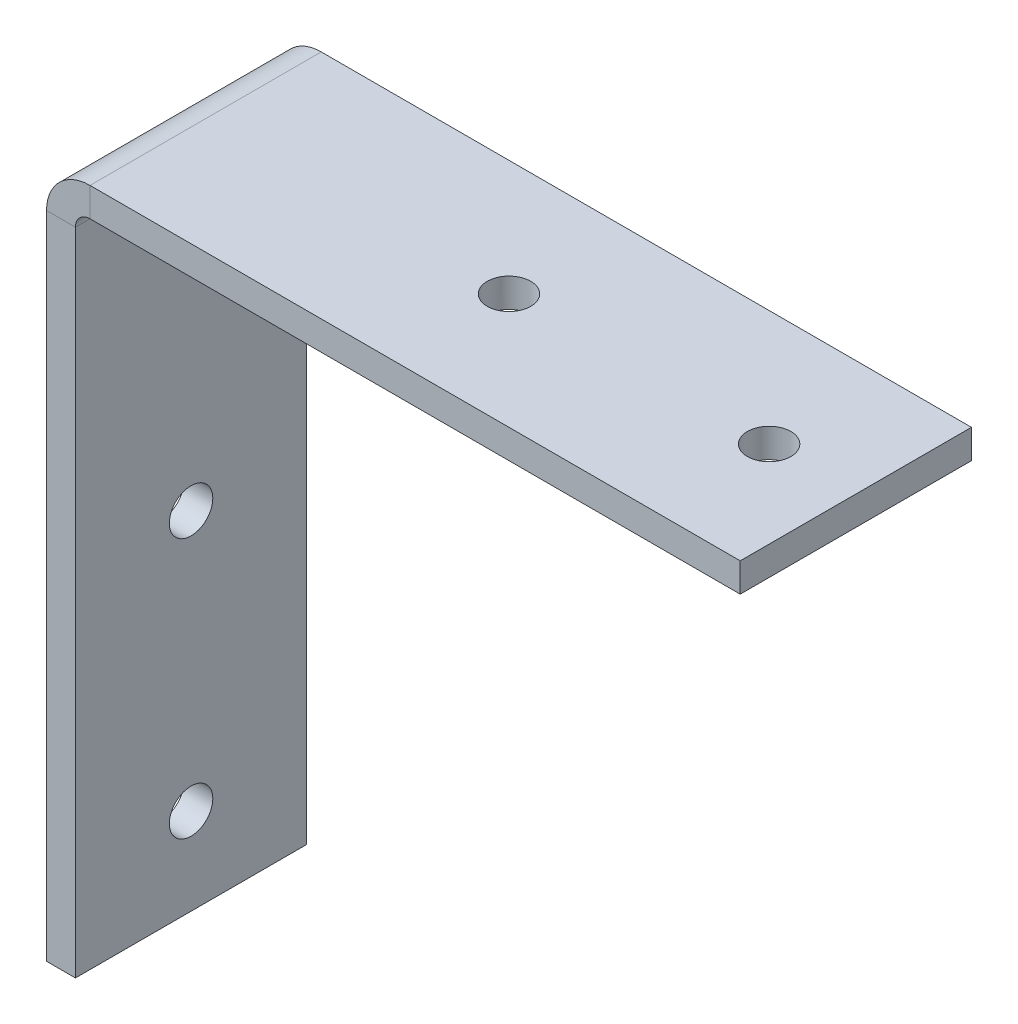
ISO-10303-21;
HEADER;
FILE_DESCRIPTION(('STEP AP214'),'2;1');
FILE_NAME('part.step','',(''),(''),'','','');
FILE_SCHEMA(('AUTOMOTIVE_DESIGN { 1 0 10303 214 1 1 1 1 }'));
ENDSEC;
DATA;
#1=APPLICATION_CONTEXT('core data for automotive mechanical design processes');
#2=APPLICATION_PROTOCOL_DEFINITION('international standard','automotive_design',2000,#1);
#3=PRODUCT_CONTEXT('',#1,'mechanical');
#4=PRODUCT('Part','Part','',(#3));
#5=PRODUCT_RELATED_PRODUCT_CATEGORY('part','',(#4));
#6=PRODUCT_DEFINITION_FORMATION('','',#4);
#7=PRODUCT_DEFINITION_CONTEXT('part definition',#1,'design');
#8=PRODUCT_DEFINITION('design','',#6,#7);
#9=PRODUCT_DEFINITION_SHAPE('','',#8);
#10=(LENGTH_UNIT() NAMED_UNIT(*) SI_UNIT(.MILLI.,.METRE.));
#11=(NAMED_UNIT(*) PLANE_ANGLE_UNIT() SI_UNIT($,.RADIAN.));
#12=(NAMED_UNIT(*) SI_UNIT($,.STERADIAN.) SOLID_ANGLE_UNIT());
#13=UNCERTAINTY_MEASURE_WITH_UNIT(LENGTH_MEASURE(1.E-05),#10,'distance_accuracy_value','');
#14=(GEOMETRIC_REPRESENTATION_CONTEXT(3) GLOBAL_UNCERTAINTY_ASSIGNED_CONTEXT((#13)) GLOBAL_UNIT_ASSIGNED_CONTEXT((#10,
#11,#12)) REPRESENTATION_CONTEXT('',''));
#15=CARTESIAN_POINT('',(0.,0.,0.));
#16=DIRECTION('',(0.,0.,1.));
#17=DIRECTION('',(1.,0.,0.));
#18=AXIS2_PLACEMENT_3D('',#15,#16,#17);
#19=CARTESIAN_POINT('',(0.,-4.7752,-25.4));
#20=DIRECTION('',(0.,0.,-1.));
#21=DIRECTION('',(-1.,0.,0.));
#22=AXIS2_PLACEMENT_3D('',#19,#20,#21);
#23=PLANE('',#22);
#24=DIRECTION('',(1.,0.,0.));
#25=VECTOR('',#24,1.);
#26=CARTESIAN_POINT('',(0.,-4.7752,-25.4));
#27=LINE('',#26,#25);
#28=CARTESIAN_POINT('',(0.,-4.7752,-25.4));
#29=VERTEX_POINT('',#28);
#30=CARTESIAN_POINT('',(3.175,-4.7752,-25.4));
#31=VERTEX_POINT('',#30);
#32=EDGE_CURVE('E11',#29,#31,#27,.T.);
#33=ORIENTED_EDGE('',*,*,#32,.F.);
#34=CARTESIAN_POINT('',(4.7752,-4.7752,-25.4));
#35=DIRECTION('',(0.,0.,1.));
#36=DIRECTION('',(1.,0.,0.));
#37=AXIS2_PLACEMENT_3D('',#34,#35,#36);
#38=CIRCLE('',#37,4.7752);
#39=CARTESIAN_POINT('',(4.7752,0.,-25.4));
#40=VERTEX_POINT('',#39);
#41=EDGE_CURVE('E149',#29,#40,#38,.F.);
#42=ORIENTED_EDGE('',*,*,#41,.T.);
#43=DIRECTION('',(0.,1.,0.));
#44=VECTOR('',#43,1.);
#45=CARTESIAN_POINT('',(4.7752,-3.175,-25.4));
#46=LINE('',#45,#44);
#47=CARTESIAN_POINT('',(4.7752,-3.175,-25.4));
#48=VERTEX_POINT('',#47);
#49=EDGE_CURVE('E41',#48,#40,#46,.T.);
#50=ORIENTED_EDGE('',*,*,#49,.F.);
#51=CARTESIAN_POINT('',(4.7752,-4.7752,-25.4));
#52=DIRECTION('',(0.,0.,1.));
#53=DIRECTION('',(1.,0.,0.));
#54=AXIS2_PLACEMENT_3D('',#51,#52,#53);
#55=CIRCLE('',#54,1.6002);
#56=EDGE_CURVE('E109',#31,#48,#55,.F.);
#57=ORIENTED_EDGE('',*,*,#56,.F.);
#58=EDGE_LOOP('',(#33,#42,#50,#57));
#59=FACE_BOUND('',#58,.T.);
#60=ADVANCED_FACE('F34',(#59),#23,.T.);
#61=CARTESIAN_POINT('',(4.7752,-3.175,-25.4));
#62=DIRECTION('',(0.,0.,-1.));
#63=DIRECTION('',(-1.,0.,0.));
#64=AXIS2_PLACEMENT_3D('',#61,#62,#63);
#65=PLANE('',#64);
#66=DIRECTION('',(0.,1.,0.));
#67=VECTOR('',#66,1.);
#68=CARTESIAN_POINT('',(0.,0.,-25.4));
#69=LINE('',#68,#67);
#70=CARTESIAN_POINT('',(0.,-76.2,-25.4));
#71=VERTEX_POINT('',#70);
#72=EDGE_CURVE('E151',#71,#29,#69,.T.);
#73=ORIENTED_EDGE('',*,*,#72,.T.);
#74=ORIENTED_EDGE('',*,*,#32,.T.);
#75=DIRECTION('',(0.,1.,0.));
#76=VECTOR('',#75,1.);
#77=CARTESIAN_POINT('',(3.175,0.,-25.4));
#78=LINE('',#77,#76);
#79=CARTESIAN_POINT('',(3.17500000000001,-76.2,-25.4));
#80=VERTEX_POINT('',#79);
#81=EDGE_CURVE('E155',#80,#31,#78,.T.);
#82=ORIENTED_EDGE('',*,*,#81,.F.);
#83=DIRECTION('',(-1.,0.,0.));
#84=VECTOR('',#83,1.);
#85=CARTESIAN_POINT('',(3.17500000000001,-76.2,-25.4));
#86=LINE('',#85,#84);
#87=EDGE_CURVE('E153',#80,#71,#86,.T.);
#88=ORIENTED_EDGE('',*,*,#87,.T.);
#89=EDGE_LOOP('',(#73,#74,#82,#88));
#90=FACE_BOUND('',#89,.T.);
#91=ADVANCED_FACE('F202',(#90),#65,.T.);
#92=CARTESIAN_POINT('',(4.7752,0.,0.));
#93=DIRECTION('',(0.,0.,1.));
#94=DIRECTION('',(1.,0.,0.));
#95=AXIS2_PLACEMENT_3D('',#92,#93,#94);
#96=PLANE('',#95);
#97=DIRECTION('',(0.,-1.,0.));
#98=VECTOR('',#97,1.);
#99=CARTESIAN_POINT('',(4.7752,0.,0.));
#100=LINE('',#99,#98);
#101=CARTESIAN_POINT('',(4.7752,0.,0.));
#102=VERTEX_POINT('',#101);
#103=CARTESIAN_POINT('',(4.7752,-3.175,0.));
#104=VERTEX_POINT('',#103);
#105=EDGE_CURVE('E121',#102,#104,#100,.T.);
#106=ORIENTED_EDGE('',*,*,#105,.F.);
#107=CARTESIAN_POINT('',(4.7752,-4.7752,0.));
#108=DIRECTION('',(0.,0.,1.));
#109=DIRECTION('',(1.,0.,0.));
#110=AXIS2_PLACEMENT_3D('',#107,#108,#109);
#111=CIRCLE('',#110,4.7752);
#112=CARTESIAN_POINT('',(0.,-4.7752,0.));
#113=VERTEX_POINT('',#112);
#114=EDGE_CURVE('E131',#113,#102,#111,.F.);
#115=ORIENTED_EDGE('',*,*,#114,.F.);
#116=DIRECTION('',(-1.,0.,0.));
#117=VECTOR('',#116,1.);
#118=CARTESIAN_POINT('',(3.175,-4.7752,0.));
#119=LINE('',#118,#117);
#120=CARTESIAN_POINT('',(3.175,-4.7752,0.));
#121=VERTEX_POINT('',#120);
#122=EDGE_CURVE('E162',#121,#113,#119,.T.);
#123=ORIENTED_EDGE('',*,*,#122,.F.);
#124=CARTESIAN_POINT('',(4.7752,-4.7752,0.));
#125=DIRECTION('',(0.,0.,1.));
#126=DIRECTION('',(1.,0.,0.));
#127=AXIS2_PLACEMENT_3D('',#124,#125,#126);
#128=CIRCLE('',#127,1.6002);
#129=EDGE_CURVE('E142',#121,#104,#128,.F.);
#130=ORIENTED_EDGE('',*,*,#129,.T.);
#131=EDGE_LOOP('',(#106,#115,#123,#130));
#132=FACE_BOUND('',#131,.T.);
#133=ADVANCED_FACE('F206',(#132),#96,.T.);
#134=CARTESIAN_POINT('',(3.175,-4.7752,0.));
#135=DIRECTION('',(0.,0.,1.));
#136=DIRECTION('',(1.,0.,0.));
#137=AXIS2_PLACEMENT_3D('',#134,#135,#136);
#138=PLANE('',#137);
#139=DIRECTION('',(1.,0.,0.));
#140=VECTOR('',#139,1.);
#141=CARTESIAN_POINT('',(0.,0.,0.));
#142=LINE('',#141,#140);
#143=CARTESIAN_POINT('',(76.2,0.,0.));
#144=VERTEX_POINT('',#143);
#145=EDGE_CURVE('E118',#102,#144,#142,.T.);
#146=ORIENTED_EDGE('',*,*,#145,.F.);
#147=ORIENTED_EDGE('',*,*,#105,.T.);
#148=DIRECTION('',(1.,0.,0.));
#149=VECTOR('',#148,1.);
#150=CARTESIAN_POINT('',(0.,-3.175,0.));
#151=LINE('',#150,#149);
#152=CARTESIAN_POINT('',(76.2,-3.175,0.));
#153=VERTEX_POINT('',#152);
#154=EDGE_CURVE('E102',#104,#153,#151,.T.);
#155=ORIENTED_EDGE('',*,*,#154,.T.);
#156=DIRECTION('',(0.,-1.,0.));
#157=VECTOR('',#156,1.);
#158=CARTESIAN_POINT('',(76.2,0.,0.));
#159=LINE('',#158,#157);
#160=EDGE_CURVE('E113',#144,#153,#159,.T.);
#161=ORIENTED_EDGE('',*,*,#160,.F.);
#162=EDGE_LOOP('',(#146,#147,#155,#161));
#163=FACE_BOUND('',#162,.T.);
#164=ADVANCED_FACE('F120',(#163),#138,.T.);
#165=CARTESIAN_POINT('',(0.,-3.175,-25.4));
#166=DIRECTION('',(0.,-1.,0.));
#167=DIRECTION('',(0.,0.,-1.));
#168=AXIS2_PLACEMENT_3D('',#165,#166,#167);
#169=PLANE('',#168);
#170=CARTESIAN_POINT('',(38.1,-3.175,-12.7));
#171=DIRECTION('',(0.,-1.,0.));
#172=DIRECTION('',(0.,0.,-1.));
#173=AXIS2_PLACEMENT_3D('',#170,#171,#172);
#174=CIRCLE('',#173,2.38760000000001);
#175=CARTESIAN_POINT('',(38.1,-3.175,-15.0876));
#176=VERTEX_POINT('',#175);
#177=EDGE_CURVE('E227',#176,#176,#174,.T.);
#178=ORIENTED_EDGE('',*,*,#177,.F.);
#179=EDGE_LOOP('',(#178));
#180=FACE_BOUND('',#179,.T.);
#181=CARTESIAN_POINT('',(66.675,-3.175,-12.7));
#182=DIRECTION('',(0.,-1.,0.));
#183=DIRECTION('',(0.,0.,-1.));
#184=AXIS2_PLACEMENT_3D('',#181,#182,#183);
#185=CIRCLE('',#184,2.38760000000001);
#186=CARTESIAN_POINT('',(66.675,-3.175,-15.0876));
#187=VERTEX_POINT('',#186);
#188=EDGE_CURVE('E123',#187,#187,#185,.T.);
#189=ORIENTED_EDGE('',*,*,#188,.F.);
#190=EDGE_LOOP('',(#189));
#191=FACE_BOUND('',#190,.T.);
#192=ORIENTED_EDGE('',*,*,#154,.F.);
#193=DIRECTION('',(0.,0.,1.));
#194=VECTOR('',#193,1.);
#195=CARTESIAN_POINT('',(4.7752,-3.175,-25.4));
#196=LINE('',#195,#194);
#197=EDGE_CURVE('E160',#48,#104,#196,.T.);
#198=ORIENTED_EDGE('',*,*,#197,.F.);
#199=DIRECTION('',(1.,0.,0.));
#200=VECTOR('',#199,1.);
#201=CARTESIAN_POINT('',(0.,-3.175,-25.4));
#202=LINE('',#201,#200);
#203=CARTESIAN_POINT('',(76.2,-3.175,-25.4));
#204=VERTEX_POINT('',#203);
#205=EDGE_CURVE('E105',#48,#204,#202,.T.);
#206=ORIENTED_EDGE('',*,*,#205,.T.);
#207=DIRECTION('',(0.,0.,1.));
#208=VECTOR('',#207,1.);
#209=CARTESIAN_POINT('',(76.2,-3.175,-25.4));
#210=LINE('',#209,#208);
#211=EDGE_CURVE('E98',#204,#153,#210,.T.);
#212=ORIENTED_EDGE('',*,*,#211,.T.);
#213=EDGE_LOOP('',(#192,#198,#206,#212));
#214=FACE_BOUND('',#213,.T.);
#215=ADVANCED_FACE('F100',(#180,#191,#214),#169,.T.);
#216=CARTESIAN_POINT('',(4.7752,-4.7752,-25.4));
#217=DIRECTION('',(0.,0.,1.));
#218=DIRECTION('',(1.,0.,0.));
#219=AXIS2_PLACEMENT_3D('',#216,#217,#218);
#220=CYLINDRICAL_SURFACE('',#219,1.6002);
#221=ORIENTED_EDGE('',*,*,#129,.F.);
#222=DIRECTION('',(0.,0.,1.));
#223=VECTOR('',#222,1.);
#224=CARTESIAN_POINT('',(3.175,-4.7752,-25.4));
#225=LINE('',#224,#223);
#226=EDGE_CURVE('E163',#31,#121,#225,.T.);
#227=ORIENTED_EDGE('',*,*,#226,.F.);
#228=ORIENTED_EDGE('',*,*,#56,.T.);
#229=ORIENTED_EDGE('',*,*,#197,.T.);
#230=EDGE_LOOP('',(#221,#227,#228,#229));
#231=FACE_BOUND('',#230,.T.);
#232=ADVANCED_FACE('F216',(#231),#220,.F.);
#233=CARTESIAN_POINT('',(3.175,0.,-25.4));
#234=DIRECTION('',(1.,0.,0.));
#235=DIRECTION('',(0.,1.,0.));
#236=AXIS2_PLACEMENT_3D('',#233,#234,#235);
#237=PLANE('',#236);
#238=CARTESIAN_POINT('',(3.175,-38.1,-12.7));
#239=DIRECTION('',(1.,0.,0.));
#240=DIRECTION('',(0.,1.,0.));
#241=AXIS2_PLACEMENT_3D('',#238,#239,#240);
#242=CIRCLE('',#241,2.3876);
#243=CARTESIAN_POINT('',(3.175,-35.7124,-12.7));
#244=VERTEX_POINT('',#243);
#245=EDGE_CURVE('E249',#244,#244,#242,.T.);
#246=ORIENTED_EDGE('',*,*,#245,.F.);
#247=EDGE_LOOP('',(#246));
#248=FACE_BOUND('',#247,.T.);
#249=CARTESIAN_POINT('',(3.17500000000001,-66.675,-12.7));
#250=DIRECTION('',(1.,0.,0.));
#251=DIRECTION('',(0.,1.,0.));
#252=AXIS2_PLACEMENT_3D('',#249,#250,#251);
#253=CIRCLE('',#252,2.3876);
#254=CARTESIAN_POINT('',(3.17500000000001,-64.2874,-12.7));
#255=VERTEX_POINT('',#254);
#256=EDGE_CURVE('E243',#255,#255,#253,.T.);
#257=ORIENTED_EDGE('',*,*,#256,.F.);
#258=EDGE_LOOP('',(#257));
#259=FACE_BOUND('',#258,.T.);
#260=DIRECTION('',(0.,1.,0.));
#261=VECTOR('',#260,1.);
#262=CARTESIAN_POINT('',(3.175,0.,0.));
#263=LINE('',#262,#261);
#264=CARTESIAN_POINT('',(3.17500000000001,-76.2,0.));
#265=VERTEX_POINT('',#264);
#266=EDGE_CURVE('E139',#265,#121,#263,.T.);
#267=ORIENTED_EDGE('',*,*,#266,.F.);
#268=DIRECTION('',(0.,0.,1.));
#269=VECTOR('',#268,1.);
#270=CARTESIAN_POINT('',(3.17500000000001,-76.2,-25.4));
#271=LINE('',#270,#269);
#272=EDGE_CURVE('E166',#80,#265,#271,.T.);
#273=ORIENTED_EDGE('',*,*,#272,.F.);
#274=ORIENTED_EDGE('',*,*,#81,.T.);
#275=ORIENTED_EDGE('',*,*,#226,.T.);
#276=EDGE_LOOP('',(#267,#273,#274,#275));
#277=FACE_BOUND('',#276,.T.);
#278=ADVANCED_FACE('F221',(#248,#259,#277),#237,.T.);
#279=CARTESIAN_POINT('',(3.17500000000001,-76.2,-25.4));
#280=DIRECTION('',(0.,1.,0.));
#281=DIRECTION('',(0.,0.,1.));
#282=AXIS2_PLACEMENT_3D('',#279,#280,#281);
#283=PLANE('',#282);
#284=DIRECTION('',(-1.,0.,0.));
#285=VECTOR('',#284,1.);
#286=CARTESIAN_POINT('',(3.17500000000001,-76.2,0.));
#287=LINE('',#286,#285);
#288=CARTESIAN_POINT('',(0.,-76.2,0.));
#289=VERTEX_POINT('',#288);
#290=EDGE_CURVE('E137',#265,#289,#287,.T.);
#291=ORIENTED_EDGE('',*,*,#290,.T.);
#292=DIRECTION('',(0.,0.,1.));
#293=VECTOR('',#292,1.);
#294=CARTESIAN_POINT('',(0.,-76.2,-25.4));
#295=LINE('',#294,#293);
#296=EDGE_CURVE('E168',#71,#289,#295,.T.);
#297=ORIENTED_EDGE('',*,*,#296,.F.);
#298=ORIENTED_EDGE('',*,*,#87,.F.);
#299=ORIENTED_EDGE('',*,*,#272,.T.);
#300=EDGE_LOOP('',(#291,#297,#298,#299));
#301=FACE_BOUND('',#300,.T.);
#302=ADVANCED_FACE('F260',(#301),#283,.F.);
#303=CARTESIAN_POINT('',(0.,0.,-25.4));
#304=DIRECTION('',(1.,0.,0.));
#305=DIRECTION('',(0.,1.,0.));
#306=AXIS2_PLACEMENT_3D('',#303,#304,#305);
#307=PLANE('',#306);
#308=CARTESIAN_POINT('',(0.,-38.1,-12.7));
#309=DIRECTION('',(-1.,0.,0.));
#310=DIRECTION('',(0.,-1.,0.));
#311=AXIS2_PLACEMENT_3D('',#308,#309,#310);
#312=CIRCLE('',#311,2.3876);
#313=CARTESIAN_POINT('',(0.,-40.4876,-12.7));
#314=VERTEX_POINT('',#313);
#315=EDGE_CURVE('E252',#314,#314,#312,.T.);
#316=ORIENTED_EDGE('',*,*,#315,.F.);
#317=EDGE_LOOP('',(#316));
#318=FACE_BOUND('',#317,.T.);
#319=CARTESIAN_POINT('',(0.,-66.675,-12.7));
#320=DIRECTION('',(-1.,0.,0.));
#321=DIRECTION('',(0.,-1.,0.));
#322=AXIS2_PLACEMENT_3D('',#319,#320,#321);
#323=CIRCLE('',#322,2.3876);
#324=CARTESIAN_POINT('',(0.,-69.0626,-12.7));
#325=VERTEX_POINT('',#324);
#326=EDGE_CURVE('E246',#325,#325,#323,.T.);
#327=ORIENTED_EDGE('',*,*,#326,.F.);
#328=EDGE_LOOP('',(#327));
#329=FACE_BOUND('',#328,.T.);
#330=DIRECTION('',(0.,1.,0.));
#331=VECTOR('',#330,1.);
#332=CARTESIAN_POINT('',(0.,0.,0.));
#333=LINE('',#332,#331);
#334=EDGE_CURVE('E134',#289,#113,#333,.T.);
#335=ORIENTED_EDGE('',*,*,#334,.T.);
#336=DIRECTION('',(0.,0.,1.));
#337=VECTOR('',#336,1.);
#338=CARTESIAN_POINT('',(0.,-4.7752,-25.4));
#339=LINE('',#338,#337);
#340=EDGE_CURVE('E171',#29,#113,#339,.T.);
#341=ORIENTED_EDGE('',*,*,#340,.F.);
#342=ORIENTED_EDGE('',*,*,#72,.F.);
#343=ORIENTED_EDGE('',*,*,#296,.T.);
#344=EDGE_LOOP('',(#335,#341,#342,#343));
#345=FACE_BOUND('',#344,.T.);
#346=ADVANCED_FACE('F197',(#318,#329,#345),#307,.F.);
#347=CARTESIAN_POINT('',(4.7752,-4.7752,-25.4));
#348=DIRECTION('',(0.,0.,1.));
#349=DIRECTION('',(1.,0.,0.));
#350=AXIS2_PLACEMENT_3D('',#347,#348,#349);
#351=CYLINDRICAL_SURFACE('',#350,4.7752);
#352=ORIENTED_EDGE('',*,*,#114,.T.);
#353=DIRECTION('',(0.,0.,1.));
#354=VECTOR('',#353,1.);
#355=CARTESIAN_POINT('',(4.7752,0.,-25.4));
#356=LINE('',#355,#354);
#357=EDGE_CURVE('E174',#40,#102,#356,.T.);
#358=ORIENTED_EDGE('',*,*,#357,.F.);
#359=ORIENTED_EDGE('',*,*,#41,.F.);
#360=ORIENTED_EDGE('',*,*,#340,.T.);
#361=EDGE_LOOP('',(#352,#358,#359,#360));
#362=FACE_BOUND('',#361,.T.);
#363=ADVANCED_FACE('F185',(#362),#351,.T.);
#364=CARTESIAN_POINT('',(0.,0.,-25.4));
#365=DIRECTION('',(0.,-1.,0.));
#366=DIRECTION('',(0.,0.,-1.));
#367=AXIS2_PLACEMENT_3D('',#364,#365,#366);
#368=PLANE('',#367);
#369=CARTESIAN_POINT('',(38.1,0.,-12.7));
#370=DIRECTION('',(0.,1.,0.));
#371=DIRECTION('',(0.,0.,1.));
#372=AXIS2_PLACEMENT_3D('',#369,#370,#371);
#373=CIRCLE('',#372,2.38760000000001);
#374=CARTESIAN_POINT('',(38.1,0.,-10.3124));
#375=VERTEX_POINT('',#374);
#376=EDGE_CURVE('E238',#375,#375,#373,.T.);
#377=ORIENTED_EDGE('',*,*,#376,.F.);
#378=EDGE_LOOP('',(#377));
#379=FACE_BOUND('',#378,.T.);
#380=CARTESIAN_POINT('',(66.675,0.,-12.7));
#381=DIRECTION('',(0.,1.,0.));
#382=DIRECTION('',(0.,0.,1.));
#383=AXIS2_PLACEMENT_3D('',#380,#381,#382);
#384=CIRCLE('',#383,2.38760000000001);
#385=CARTESIAN_POINT('',(66.675,0.,-10.3124));
#386=VERTEX_POINT('',#385);
#387=EDGE_CURVE('E126',#386,#386,#384,.T.);
#388=ORIENTED_EDGE('',*,*,#387,.F.);
#389=EDGE_LOOP('',(#388));
#390=FACE_BOUND('',#389,.T.);
#391=ORIENTED_EDGE('',*,*,#145,.T.);
#392=DIRECTION('',(0.,0.,1.));
#393=VECTOR('',#392,1.);
#394=CARTESIAN_POINT('',(76.2,0.,-25.4));
#395=LINE('',#394,#393);
#396=CARTESIAN_POINT('',(76.2,0.,-25.4));
#397=VERTEX_POINT('',#396);
#398=EDGE_CURVE('E108',#397,#144,#395,.T.);
#399=ORIENTED_EDGE('',*,*,#398,.F.);
#400=DIRECTION('',(1.,0.,0.));
#401=VECTOR('',#400,1.);
#402=CARTESIAN_POINT('',(0.,0.,-25.4));
#403=LINE('',#402,#401);
#404=EDGE_CURVE('E147',#40,#397,#403,.T.);
#405=ORIENTED_EDGE('',*,*,#404,.F.);
#406=ORIENTED_EDGE('',*,*,#357,.T.);
#407=EDGE_LOOP('',(#391,#399,#405,#406));
#408=FACE_BOUND('',#407,.T.);
#409=ADVANCED_FACE('F188',(#379,#390,#408),#368,.F.);
#410=CARTESIAN_POINT('',(76.2,0.,-25.4));
#411=DIRECTION('',(-1.,0.,0.));
#412=DIRECTION('',(0.,0.,1.));
#413=AXIS2_PLACEMENT_3D('',#410,#411,#412);
#414=PLANE('',#413);
#415=ORIENTED_EDGE('',*,*,#160,.T.);
#416=ORIENTED_EDGE('',*,*,#211,.F.);
#417=DIRECTION('',(0.,-1.,0.));
#418=VECTOR('',#417,1.);
#419=CARTESIAN_POINT('',(76.2,0.,-25.4));
#420=LINE('',#419,#418);
#421=EDGE_CURVE('E145',#397,#204,#420,.T.);
#422=ORIENTED_EDGE('',*,*,#421,.F.);
#423=ORIENTED_EDGE('',*,*,#398,.T.);
#424=EDGE_LOOP('',(#415,#416,#422,#423));
#425=FACE_BOUND('',#424,.T.);
#426=ADVANCED_FACE('F114',(#425),#414,.F.);
#427=CARTESIAN_POINT('',(4.7752,-4.7752,-25.4));
#428=DIRECTION('',(0.,0.,1.));
#429=DIRECTION('',(1.,0.,0.));
#430=AXIS2_PLACEMENT_3D('',#427,#428,#429);
#431=PLANE('',#430);
#432=ORIENTED_EDGE('',*,*,#205,.F.);
#433=ORIENTED_EDGE('',*,*,#49,.T.);
#434=ORIENTED_EDGE('',*,*,#404,.T.);
#435=ORIENTED_EDGE('',*,*,#421,.T.);
#436=EDGE_LOOP('',(#432,#433,#434,#435));
#437=FACE_BOUND('',#436,.T.);
#438=ADVANCED_FACE('F180',(#437),#431,.F.);
#439=CARTESIAN_POINT('',(4.7752,-4.7752,0.));
#440=DIRECTION('',(0.,0.,1.));
#441=DIRECTION('',(1.,0.,0.));
#442=AXIS2_PLACEMENT_3D('',#439,#440,#441);
#443=PLANE('',#442);
#444=ORIENTED_EDGE('',*,*,#266,.T.);
#445=ORIENTED_EDGE('',*,*,#122,.T.);
#446=ORIENTED_EDGE('',*,*,#334,.F.);
#447=ORIENTED_EDGE('',*,*,#290,.F.);
#448=EDGE_LOOP('',(#444,#445,#446,#447));
#449=FACE_BOUND('',#448,.T.);
#450=ADVANCED_FACE('F234',(#449),#443,.T.);
#451=CARTESIAN_POINT('',(66.675,-5.08,-12.7));
#452=DIRECTION('',(0.,1.,0.));
#453=DIRECTION('',(0.,0.,1.));
#454=AXIS2_PLACEMENT_3D('',#451,#452,#453);
#455=CYLINDRICAL_SURFACE('',#454,2.38760000000001);
#456=ORIENTED_EDGE('',*,*,#188,.T.);
#457=EDGE_LOOP('',(#456));
#458=FACE_BOUND('',#457,.T.);
#459=ORIENTED_EDGE('',*,*,#387,.T.);
#460=EDGE_LOOP('',(#459));
#461=FACE_BOUND('',#460,.T.);
#462=ADVANCED_FACE('F230',(#458,#461),#455,.F.);
#463=CARTESIAN_POINT('',(38.1,-5.08,-12.7));
#464=DIRECTION('',(0.,1.,0.));
#465=DIRECTION('',(0.,0.,1.));
#466=AXIS2_PLACEMENT_3D('',#463,#464,#465);
#467=CYLINDRICAL_SURFACE('',#466,2.38760000000001);
#468=ORIENTED_EDGE('',*,*,#177,.T.);
#469=EDGE_LOOP('',(#468));
#470=FACE_BOUND('',#469,.T.);
#471=ORIENTED_EDGE('',*,*,#376,.T.);
#472=EDGE_LOOP('',(#471));
#473=FACE_BOUND('',#472,.T.);
#474=ADVANCED_FACE('F233',(#470,#473),#467,.F.);
#475=CARTESIAN_POINT('',(5.08000000000001,-66.675,-12.7));
#476=DIRECTION('',(-1.,0.,0.));
#477=DIRECTION('',(0.,-1.,0.));
#478=AXIS2_PLACEMENT_3D('',#475,#476,#477);
#479=CYLINDRICAL_SURFACE('',#478,2.3876);
#480=ORIENTED_EDGE('',*,*,#256,.T.);
#481=EDGE_LOOP('',(#480));
#482=FACE_BOUND('',#481,.T.);
#483=ORIENTED_EDGE('',*,*,#326,.T.);
#484=EDGE_LOOP('',(#483));
#485=FACE_BOUND('',#484,.T.);
#486=ADVANCED_FACE('F348',(#482,#485),#479,.F.);
#487=CARTESIAN_POINT('',(5.08,-38.1,-12.7));
#488=DIRECTION('',(-1.,0.,0.));
#489=DIRECTION('',(0.,-1.,0.));
#490=AXIS2_PLACEMENT_3D('',#487,#488,#489);
#491=CYLINDRICAL_SURFACE('',#490,2.3876);
#492=ORIENTED_EDGE('',*,*,#245,.T.);
#493=EDGE_LOOP('',(#492));
#494=FACE_BOUND('',#493,.T.);
#495=ORIENTED_EDGE('',*,*,#315,.T.);
#496=EDGE_LOOP('',(#495));
#497=FACE_BOUND('',#496,.T.);
#498=ADVANCED_FACE('F256',(#494,#497),#491,.F.);
#499=CLOSED_SHELL('',(#60,#91,#133,#164,#215,#232,#278,#302,#346,#363,#409,#426,#438,#450,#462,
#474,#486,#498));
#500=MANIFOLD_SOLID_BREP('B2',#499);
#501=ADVANCED_BREP_SHAPE_REPRESENTATION('',(#18,#500),#14);
#502=SHAPE_DEFINITION_REPRESENTATION(#9,#501);
ENDSEC;
END-ISO-10303-21;
